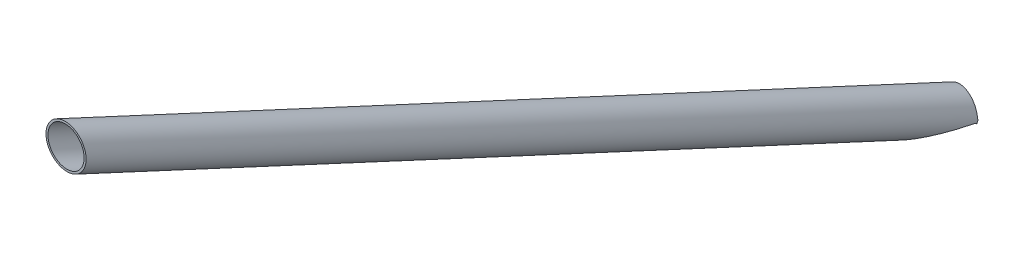
ISO-10303-21;
HEADER;
FILE_DESCRIPTION(('STEP AP214'),'2;1');
FILE_NAME('part.step','',(''),(''),'','','');
FILE_SCHEMA(('AUTOMOTIVE_DESIGN { 1 0 10303 214 1 1 1 1 }'));
ENDSEC;
DATA;
#1=APPLICATION_CONTEXT('core data for automotive mechanical design processes');
#2=APPLICATION_PROTOCOL_DEFINITION('international standard','automotive_design',2000,#1);
#3=PRODUCT_CONTEXT('',#1,'mechanical');
#4=PRODUCT('Part','Part','',(#3));
#5=PRODUCT_RELATED_PRODUCT_CATEGORY('part','',(#4));
#6=PRODUCT_DEFINITION_FORMATION('','',#4);
#7=PRODUCT_DEFINITION_CONTEXT('part definition',#1,'design');
#8=PRODUCT_DEFINITION('design','',#6,#7);
#9=PRODUCT_DEFINITION_SHAPE('','',#8);
#10=(LENGTH_UNIT() NAMED_UNIT(*) SI_UNIT(.MILLI.,.METRE.));
#11=(NAMED_UNIT(*) PLANE_ANGLE_UNIT() SI_UNIT($,.RADIAN.));
#12=(NAMED_UNIT(*) SI_UNIT($,.STERADIAN.) SOLID_ANGLE_UNIT());
#13=UNCERTAINTY_MEASURE_WITH_UNIT(LENGTH_MEASURE(1.E-05),#10,'distance_accuracy_value','');
#14=(GEOMETRIC_REPRESENTATION_CONTEXT(3) GLOBAL_UNCERTAINTY_ASSIGNED_CONTEXT((#13)) GLOBAL_UNIT_ASSIGNED_CONTEXT((#10,
#11,#12)) REPRESENTATION_CONTEXT('',''));
#15=CARTESIAN_POINT('',(0.,0.,0.));
#16=DIRECTION('',(0.,0.,1.));
#17=DIRECTION('',(1.,0.,0.));
#18=AXIS2_PLACEMENT_3D('',#15,#16,#17);
#19=CARTESIAN_POINT('',(238.578451545606,263.413321195737,924.828445427606));
#20=DIRECTION('',(-0.125935860789219,0.361465966011555,0.923841173786172));
#21=DIRECTION('',(0.,-0.931255470532932,0.364366914802222));
#22=AXIS2_PLACEMENT_3D('',#19,#20,#21);
#23=CYLINDRICAL_SURFACE('',#22,12.7);
#24=CARTESIAN_POINT('',(170.006234196331,460.231944821897,1427.861));
#25=DIRECTION('',(0.,0.,-1.));
#26=DIRECTION('',(-0.329006657768653,0.944327601600155,0.));
#27=AXIS2_PLACEMENT_3D('',#24,#25,#26);
#28=ELLIPSE('',#27,13.7469517059429,12.7);
#29=CARTESIAN_POINT('',(165.483395561052,473.213570755684,1427.861));
#30=VERTEX_POINT('',#29);
#31=EDGE_CURVE('E158',#30,#30,#28,.T.);
#32=ORIENTED_EDGE('',*,*,#31,.T.);
#33=EDGE_LOOP('',(#32));
#34=FACE_BOUND('',#33,.T.);
#35=CARTESIAN_POINT('',(238.578451545606,263.413321195737,924.828445427606));
#36=DIRECTION('',(0.125935860789219,-0.361465966011555,-0.923841173786172));
#37=DIRECTION('',(-0.954086751467199,0.210986526767557,-0.212610338876855));
#38=AXIS2_PLACEMENT_3D('',#35,#36,#37);
#39=CIRCLE('',#38,12.7);
#40=CARTESIAN_POINT('',(251.162272400525,264.573616406887,926.089860392744));
#41=VERTEX_POINT('',#40);
#42=CARTESIAN_POINT('',(251.081438817533,262.535172699457,926.876411368852));
#43=VERTEX_POINT('',#42);
#44=EDGE_CURVE('E53',#41,#43,#39,.T.);
#45=ORIENTED_EDGE('',*,*,#44,.F.);
#46=CARTESIAN_POINT('',(241.922856229249,276.336746641463,924.68186899289));
#47=CARTESIAN_POINT('',(242.262411150871,276.237672237515,924.72694670792));
#48=CARTESIAN_POINT('',(242.597517083185,276.12352683015,924.772089891833));
#49=CARTESIAN_POINT('',(243.256419238333,275.86648253904,924.862245588027));
#50=CARTESIAN_POINT('',(243.58021886095,275.723592387698,924.907258135793));
#51=CARTESIAN_POINT('',(244.213374189463,275.410845398106,924.996786914815));
#52=CARTESIAN_POINT('',(244.522769528821,275.241069004146,925.041304215563));
#53=CARTESIAN_POINT('',(245.126097823624,274.875815825225,925.129746354796));
#54=CARTESIAN_POINT('',(245.420029983002,274.680337718912,925.173671162692));
#55=CARTESIAN_POINT('',(245.990299317339,274.265575169599,925.260658832707));
#56=CARTESIAN_POINT('',(246.266652061151,274.04631227023,925.303722433688));
#57=CARTESIAN_POINT('',(246.800413907524,273.585630053523,925.388802990756));
#58=CARTESIAN_POINT('',(247.057821942322,273.344209489054,925.430819887761));
#59=CARTESIAN_POINT('',(247.552420104961,272.840896963311,925.513601812352));
#60=CARTESIAN_POINT('',(247.789593522159,272.578988417823,925.554365787785));
#61=CARTESIAN_POINT('',(248.242205985125,272.036813973223,925.634346308955));
#62=CARTESIAN_POINT('',(248.457644980311,271.756548031393,925.673562851091));
#63=CARTESIAN_POINT('',(248.873442685707,271.16865748399,925.751603251134));
#64=CARTESIAN_POINT('',(249.072917414143,270.860397984614,925.79035557583));
#65=CARTESIAN_POINT('',(249.446213337708,270.228444177305,925.865434475569));
#66=CARTESIAN_POINT('',(249.620034166063,269.904749648785,925.901761015927));
#67=CARTESIAN_POINT('',(249.940997873069,269.244508971226,925.971320132337));
#68=CARTESIAN_POINT('',(250.08816878064,268.907976780618,926.004555940938));
#69=CARTESIAN_POINT('',(250.355374435541,268.224072358801,926.066866856188));
#70=CARTESIAN_POINT('',(250.47541877739,267.87670400991,926.095943432596));
#71=CARTESIAN_POINT('',(250.670724880743,267.230641574006,926.143437897566));
#72=CARTESIAN_POINT('',(250.750098255658,266.933260209038,926.162820931987));
#73=CARTESIAN_POINT('',(250.854866332449,266.483724564644,926.185561746119));
#74=CARTESIAN_POINT('',(250.887396900451,266.3333627301,926.192085054185));
#75=CARTESIAN_POINT('',(250.947821508132,266.031611987735,926.201880697294));
#76=CARTESIAN_POINT('',(250.975716480279,265.880223292864,926.205153686811));
#77=CARTESIAN_POINT('',(251.021822581999,265.60799115388,926.206007740189));
#78=CARTESIAN_POINT('',(251.040844405692,265.487287202669,926.204623468168));
#79=CARTESIAN_POINT('',(251.076381955181,265.245762443692,926.195909665446));
#80=CARTESIAN_POINT('',(251.092900557582,265.124941933115,926.188587021333));
#81=CARTESIAN_POINT('',(251.118114998871,264.930332812895,926.167246646989));
#82=CARTESIAN_POINT('',(251.127385258331,264.856240835769,926.156863718569));
#83=CARTESIAN_POINT('',(251.145525852742,264.709261442482,926.128728011509));
#84=CARTESIAN_POINT('',(251.154396360907,264.636373513441,926.110978459585));
#85=CARTESIAN_POINT('',(251.169176741359,264.51857769072,926.071400081837));
#86=CARTESIAN_POINT('',(251.175070512926,264.472563366372,926.052995765354));
#87=CARTESIAN_POINT('',(251.187009479439,264.384103591962,926.009244973893));
#88=CARTESIAN_POINT('',(251.193053881537,264.341643135962,925.983929836162));
#89=CARTESIAN_POINT('',(251.205437129778,264.261916580206,925.925198378812));
#90=CARTESIAN_POINT('',(251.211778582547,264.224716625475,925.891691276711));
#91=CARTESIAN_POINT('',(251.224586685495,264.157641087422,925.817976956216));
#92=CARTESIAN_POINT('',(251.231053588476,264.127782421808,925.777754614109));
#93=CARTESIAN_POINT('',(251.246311701868,264.065311915536,925.677659039281));
#94=CARTESIAN_POINT('',(251.255088242855,264.035684906454,925.61597789017));
#95=CARTESIAN_POINT('',(251.272509910974,263.985091472119,925.488523759406));
#96=CARTESIAN_POINT('',(251.281152000731,263.964238558655,925.422709098249));
#97=CARTESIAN_POINT('',(251.308426120727,263.906340818248,925.209815930993));
#98=CARTESIAN_POINT('',(251.326605186995,263.87988218589,925.05996741095));
#99=CARTESIAN_POINT('',(251.362078114321,263.837274695233,924.75845134548));
#100=CARTESIAN_POINT('',(251.379367379388,263.821175216613,924.606778547755));
#101=CARTESIAN_POINT('',(251.411389957092,263.795778399172,924.318275725269));
#102=CARTESIAN_POINT('',(251.426204384389,263.785955780488,924.181505004447));
#103=CARTESIAN_POINT('',(251.455058307651,263.76919427726,923.908866718447));
#104=CARTESIAN_POINT('',(251.469103269597,263.762231852804,923.773001222246));
#105=CARTESIAN_POINT('',(251.482839229459,263.755883172903,923.637135312614));
#106=B_SPLINE_CURVE_WITH_KNOTS('',3,(#46,#47,#48,#49,#50,#51,#52,#53,#54,#55,#56,#57,#58,#59,
#60,#61,#62,#63,#64,#65,#66,#67,#68,#69,#70,#71,#72,#73,#74,#75,#76,#77,#78,#79,#80,#81,#82,#83,
#84,#85,#86,#87,#88,#89,#90,#91,#92,#93,#94,#95,#96,#97,#98,#99,#100,#101,#102,#103,#104,#105),
.UNSPECIFIED.,.F.,.F.,(4,2,2,2,2,2,2,2,2,2,2,2,2,2,2,2,2,2,2,2,2,2,2,2,2,2,2,2,2,4),(0.,
1.06932203985242,2.13831971821239,3.20417734427003,4.27008978871623,5.33504469497544,
6.40005957844102,7.46594565218874,8.53183420642118,9.63822100305156,10.7446236162239,
11.8498557303447,12.9546963158468,13.8791506293445,14.3410095990932,14.8027755513842,
15.1693092572021,15.5354185094987,15.7614140869847,15.9873107785913,16.1366027105678,
16.2852286087658,16.435582824056,16.5862803437388,16.792075900042,17.0004575852587,
17.4588252341184,17.9193619381744,18.333059790004,18.7432811144552),.UNSPECIFIED.);
#107=CARTESIAN_POINT('',(248.342187202382,271.900947930097,925.652840738979));
#108=VERTEX_POINT('',#107);
#109=EDGE_CURVE('E152',#108,#41,#106,.T.);
#110=ORIENTED_EDGE('',*,*,#109,.F.);
#111=CARTESIAN_POINT('',(238.578451545606,263.413321195737,924.828445427607));
#112=DIRECTION('',(-0.122453148788901,0.0445630118117606,0.991473330115313));
#113=DIRECTION('',(-0.0309977592476633,0.998332347767805,-0.048699715831288));
#114=AXIS2_PLACEMENT_3D('',#111,#112,#113);
#115=ELLIPSE('',#114,13.4037909779089,12.7);
#116=CARTESIAN_POINT('',(228.310650750504,271.159917359586,923.212127422702));
#117=VERTEX_POINT('',#116);
#118=EDGE_CURVE('E108',#117,#108,#115,.F.);
#119=ORIENTED_EDGE('',*,*,#118,.F.);
#120=CARTESIAN_POINT('',(225.646317693144,263.622872240042,925.858789337785));
#121=CARTESIAN_POINT('',(225.655901365763,263.616459151996,925.777361565495));
#122=CARTESIAN_POINT('',(225.665529145158,263.610460547168,925.695914763437));
#123=CARTESIAN_POINT('',(225.68488246258,263.599553382559,925.53291627918));
#124=CARTESIAN_POINT('',(225.694608049883,263.594645404278,925.451364564238));
#125=CARTESIAN_POINT('',(225.724055399065,263.581905189945,925.20553898038));
#126=CARTESIAN_POINT('',(225.743925327928,263.576145549706,925.041135238718));
#127=CARTESIAN_POINT('',(225.775394524851,263.576294112822,924.783380320311));
#128=CARTESIAN_POINT('',(225.78685797151,263.57823628783,924.690020438377));
#129=CARTESIAN_POINT('',(225.809915058105,263.588582509962,924.503554296212));
#130=CARTESIAN_POINT('',(225.821508668141,263.596985101791,924.4104479836));
#131=CARTESIAN_POINT('',(225.840477257073,263.620544052181,924.25989658196));
#132=CARTESIAN_POINT('',(225.847836970057,263.632084109778,924.201919237305));
#133=CARTESIAN_POINT('',(225.862494803956,263.662582517849,924.087933196828));
#134=CARTESIAN_POINT('',(225.869793042214,263.681519009425,924.031919225323));
#135=CARTESIAN_POINT('',(225.882263331803,263.723519190496,923.938614725316));
#136=CARTESIAN_POINT('',(225.887488825755,263.744179948912,923.900280213494));
#137=CARTESIAN_POINT('',(225.897689459554,263.791871269276,923.827802573712));
#138=CARTESIAN_POINT('',(225.902665086035,263.818888816796,923.793651096099));
#139=CARTESIAN_POINT('',(225.912294353592,263.87863584486,923.730782700962));
#140=CARTESIAN_POINT('',(225.916948094726,263.911363539151,923.70206408976));
#141=CARTESIAN_POINT('',(225.925977120997,263.980961916997,923.650092663858));
#142=CARTESIAN_POINT('',(225.930351770319,264.01784156593,923.626852025778));
#143=CARTESIAN_POINT('',(225.944795781601,264.145767996329,923.556470264184));
#144=CARTESIAN_POINT('',(225.954531279469,264.242363756187,923.519730010505));
#145=CARTESIAN_POINT('',(225.97477189998,264.439628982703,923.459016816524));
#146=CARTESIAN_POINT('',(225.985283567309,264.54032885797,923.435171067918));
#147=CARTESIAN_POINT('',(226.008870470168,264.752844535268,923.392397100581));
#148=CARTESIAN_POINT('',(226.022095683306,264.864787585554,923.374174211526));
#149=CARTESIAN_POINT('',(226.050752845563,265.089077911937,923.342458023692));
#150=CARTESIAN_POINT('',(226.066186490534,265.201425433395,923.328968387307));
#151=CARTESIAN_POINT('',(226.116172945638,265.538772718869,923.292840784606));
#152=CARTESIAN_POINT('',(226.154373045896,265.763712966651,923.27460204485));
#153=CARTESIAN_POINT('',(226.241050397965,266.211542294074,923.244100822862));
#154=CARTESIAN_POINT('',(226.289509404427,266.434434291738,923.231827856636));
#155=CARTESIAN_POINT('',(226.39684573224,266.877682952541,923.211351721589));
#156=CARTESIAN_POINT('',(226.455714499301,267.098041540375,923.203145232007));
#157=CARTESIAN_POINT('',(226.628503149979,267.687971240258,923.185159262084));
#158=CARTESIAN_POINT('',(226.752248068249,268.054803972949,923.178250641586));
#159=CARTESIAN_POINT('',(227.029543469008,268.777313377976,923.171240361049));
#160=CARTESIAN_POINT('',(227.183112332975,269.13298301228,923.171142912396));
#161=CARTESIAN_POINT('',(227.519471934561,269.830570273933,923.176918596933));
#162=CARTESIAN_POINT('',(227.702287370928,270.172475969426,923.182796799233));
#163=CARTESIAN_POINT('',(228.09608690005,270.839447726772,923.200002374726));
#164=CARTESIAN_POINT('',(228.30706608648,271.16451670804,923.211328799693));
#165=CARTESIAN_POINT('',(228.75475620444,271.793363737143,923.238966794875));
#166=CARTESIAN_POINT('',(228.991310356383,272.097254609362,923.255248990681));
#167=CARTESIAN_POINT('',(229.4897874978,272.683213960644,923.292489948961));
#168=CARTESIAN_POINT('',(229.751712195898,272.965280967635,923.313449026531));
#169=CARTESIAN_POINT('',(230.299006935089,273.504736459327,923.359697474432));
#170=CARTESIAN_POINT('',(230.584353897856,273.762148707356,923.384982608255));
#171=CARTESIAN_POINT('',(231.176779673728,274.25010744338,923.439565394204));
#172=CARTESIAN_POINT('',(231.483855220155,274.480657956037,923.468862443796));
#173=CARTESIAN_POINT('',(232.065636140808,274.877209805306,923.526023695821));
#174=CARTESIAN_POINT('',(232.33741532141,275.04760021769,923.553337807897));
#175=CARTESIAN_POINT('',(232.893141781157,275.366698744102,923.610314768169));
#176=CARTESIAN_POINT('',(233.177086932223,275.51541063028,923.639977206356));
#177=CARTESIAN_POINT('',(233.756040770679,275.790235335369,923.701482198961));
#178=CARTESIAN_POINT('',(234.05106612385,275.916312316425,923.733328102208));
#179=CARTESIAN_POINT('',(234.650099539008,276.14465327807,923.798941049343));
#180=CARTESIAN_POINT('',(234.954110672027,276.246909008806,923.832708753772));
#181=CARTESIAN_POINT('',(235.261681681007,276.336746641463,923.867317506495));
#182=B_SPLINE_CURVE_WITH_KNOTS('',3,(#120,#121,#122,#123,#124,#125,#126,#127,#128,#129,#130,
#131,#132,#133,#134,#135,#136,#137,#138,#139,#140,#141,#142,#143,#144,#145,#146,#147,#148,#149,
#150,#151,#152,#153,#154,#155,#156,#157,#158,#159,#160,#161,#162,#163,#164,#165,#166,#167,#168,
#169,#170,#171,#172,#173,#174,#175,#176,#177,#178,#179,#180,#181),.UNSPECIFIED.,.F.,.F.,(4,2,2,
2,2,2,2,2,2,2,2,2,2,2,2,2,2,2,2,2,2,2,2,2,2,2,2,2,2,2,4),(0.,0.246701160101073,
0.493533542380308,0.990352746567353,1.27251583370563,1.55461537845681,1.73305492295526,
1.91097106204404,2.04199859027092,2.17276016134315,2.30348090056599,2.43448952628438,
2.74340178953967,3.05530802368064,3.3975986012706,3.74015344816172,4.42637313897308,
5.11138249740551,5.79583153878297,6.95598301980176,8.11685182267095,9.27870620599187,
10.4403584495158,11.5952550508405,12.7502294848522,13.9040792591587,15.0577559305905,
16.0226387812068,16.9873535374515,17.9535825093766,18.9201456130803),.UNSPECIFIED.);
#183=CARTESIAN_POINT('',(225.653172808786,263.618363974927,925.800606021783));
#184=VERTEX_POINT('',#183);
#185=EDGE_CURVE('E89',#184,#117,#182,.T.);
#186=ORIENTED_EDGE('',*,*,#185,.F.);
#187=CARTESIAN_POINT('',(238.578451545606,263.413321195737,924.828445427606));
#188=DIRECTION('',(0.0101939169366115,0.997147905169932,-0.0747806075978722));
#189=DIRECTION('',(-0.134683246519798,0.07547221485565,0.988010307583717));
#190=AXIS2_PLACEMENT_3D('',#187,#188,#189);
#191=ELLIPSE('',#190,43.7831621348584,12.7);
#192=CARTESIAN_POINT('',(250.771915872852,263.618363974929,929.224734128947));
#193=VERTEX_POINT('',#192);
#194=EDGE_CURVE('E95',#193,#184,#191,.F.);
#195=ORIENTED_EDGE('',*,*,#194,.F.);
#196=CARTESIAN_POINT('',(240.953890947356,250.451545600139,926.155937937445));
#197=CARTESIAN_POINT('',(241.295801974405,250.524374113833,926.196623248305));
#198=CARTESIAN_POINT('',(241.634715085205,250.61208220892,926.235660247046));
#199=CARTESIAN_POINT('',(242.304090387623,250.816261194939,926.310222369901));
#200=CARTESIAN_POINT('',(242.634554215928,250.932726468097,926.345748178037));
#201=CARTESIAN_POINT('',(243.284020513383,251.193175654237,926.41301717516));
#202=CARTESIAN_POINT('',(243.603045842802,251.337100572183,926.444768240757));
#203=CARTESIAN_POINT('',(244.228172916208,251.651387079607,926.50443291301));
#204=CARTESIAN_POINT('',(244.53427438074,251.821749240368,926.532346436717));
#205=CARTESIAN_POINT('',(245.131402230483,252.187442312433,926.584232146162));
#206=CARTESIAN_POINT('',(245.422432882994,252.382766100925,926.608205451799));
#207=CARTESIAN_POINT('',(245.987640394138,252.796854841201,926.652177477217));
#208=CARTESIAN_POINT('',(246.26181646187,253.015620891692,926.67217601058));
#209=CARTESIAN_POINT('',(246.791634392583,253.474919508998,926.708206675675));
#210=CARTESIAN_POINT('',(247.047273253911,253.715455586832,926.724238166051));
#211=CARTESIAN_POINT('',(247.538437388862,254.216451115307,926.752389507152));
#212=CARTESIAN_POINT('',(247.773962721192,254.476910507793,926.764509369296));
#213=CARTESIAN_POINT('',(248.229093986521,255.022508218421,926.785205371814));
#214=CARTESIAN_POINT('',(248.448164964391,255.308096366459,926.793686880679));
#215=CARTESIAN_POINT('',(248.862514833963,255.896117121741,926.806863039469));
#216=CARTESIAN_POINT('',(249.057793482364,256.198549901192,926.811557650672));
#217=CARTESIAN_POINT('',(249.423570694757,256.818279469926,926.817467253555));
#218=CARTESIAN_POINT('',(249.594055972856,257.135584108977,926.81868038611));
#219=CARTESIAN_POINT('',(249.909170946756,257.782700404537,926.81809074119));
#220=CARTESIAN_POINT('',(250.053807726024,258.112508604474,926.816288791369));
#221=CARTESIAN_POINT('',(250.266896490329,258.656048825009,926.81161109045));
#222=CARTESIAN_POINT('',(250.343504390723,258.866631294279,926.809396912814));
#223=CARTESIAN_POINT('',(250.486228924638,259.291314829829,926.804488202107));
#224=CARTESIAN_POINT('',(250.552346285841,259.505415650919,926.801793702382));
#225=CARTESIAN_POINT('',(250.673620318755,259.935641591092,926.796540107454));
#226=CARTESIAN_POINT('',(250.728825542064,260.151753048302,926.793980451416));
#227=CARTESIAN_POINT('',(250.828410777356,260.586431164601,926.790047251677));
#228=CARTESIAN_POINT('',(250.872793442353,260.804997208209,926.788673417076));
#229=CARTESIAN_POINT('',(250.938561933248,261.177424364018,926.78950149754));
#230=CARTESIAN_POINT('',(250.962838687436,261.330783490203,926.790744424284));
#231=CARTESIAN_POINT('',(251.005875574348,261.639632850021,926.796883837218));
#232=CARTESIAN_POINT('',(251.024585345376,261.795129967422,926.801812339028));
#233=CARTESIAN_POINT('',(251.047912398624,262.029652985519,926.815515414835));
#234=CARTESIAN_POINT('',(251.05493149138,262.108614115313,926.821199219727));
#235=CARTESIAN_POINT('',(251.06713485705,262.266584471836,926.836052457894));
#236=CARTESIAN_POINT('',(251.072314530295,262.345593331071,926.845230511934));
#237=CARTESIAN_POINT('',(251.080444555703,262.501796030943,926.8691146235));
#238=CARTESIAN_POINT('',(251.083425037961,262.578999808447,926.883741670974));
#239=CARTESIAN_POINT('',(251.086695510185,262.730948903268,926.922465095965));
#240=CARTESIAN_POINT('',(251.087000891497,262.805705815742,926.94650647026));
#241=CARTESIAN_POINT('',(251.084688953761,262.919885608087,926.997405324766));
#242=CARTESIAN_POINT('',(251.083192430107,262.961475726344,927.019284997583));
#243=CARTESIAN_POINT('',(251.078824286437,263.040243961354,927.069618046512));
#244=CARTESIAN_POINT('',(251.075958503571,263.077439978317,927.098043254977));
#245=CARTESIAN_POINT('',(251.068956432199,263.146002032731,927.161251802532));
#246=CARTESIAN_POINT('',(251.064816830372,263.177352519829,927.196051625905));
#247=CARTESIAN_POINT('',(251.055585126968,263.233824093957,927.270415200848));
#248=CARTESIAN_POINT('',(251.050488936933,263.258917323712,927.309999130969));
#249=CARTESIAN_POINT('',(251.03356876893,263.329366955271,927.438715442593));
#250=CARTESIAN_POINT('',(251.020711810969,263.365108907643,927.532775891722));
#251=CARTESIAN_POINT('',(250.993932453152,263.424070532791,927.725473172664));
#252=CARTESIAN_POINT('',(250.979996438896,263.447083637381,927.824158805792));
#253=CARTESIAN_POINT('',(250.949395989398,263.48941926578,928.038387117969));
#254=CARTESIAN_POINT('',(250.932646747991,263.50759480625,928.154143446972));
#255=CARTESIAN_POINT('',(250.898686097722,263.539223841907,928.386251987087));
#256=CARTESIAN_POINT('',(250.88147432088,263.552673449904,928.502604609234));
#257=CARTESIAN_POINT('',(250.82916746681,263.589177839571,928.852527824342));
#258=CARTESIAN_POINT('',(250.793479783602,263.608305775325,929.086412834323));
#259=CARTESIAN_POINT('',(250.724635823222,263.640932961574,929.528822484775));
#260=CARTESIAN_POINT('',(250.691624760044,263.654817673842,929.737346603726));
#261=CARTESIAN_POINT('',(250.624662191864,263.680924927135,930.153363788652));
#262=CARTESIAN_POINT('',(250.590715700634,263.693154807057,930.360857192771));
#263=CARTESIAN_POINT('',(250.556242151768,263.705273976253,930.568275630503));
#264=B_SPLINE_CURVE_WITH_KNOTS('',3,(#196,#197,#198,#199,#200,#201,#202,#203,#204,#205,#206,
#207,#208,#209,#210,#211,#212,#213,#214,#215,#216,#217,#218,#219,#220,#221,#222,#223,#224,#225,
#226,#227,#228,#229,#230,#231,#232,#233,#234,#235,#236,#237,#238,#239,#240,#241,#242,#243,#244,
#245,#246,#247,#248,#249,#250,#251,#252,#253,#254,#255,#256,#257,#258,#259,#260,#261,#262,#263),
.UNSPECIFIED.,.F.,.F.,(4,2,2,2,2,2,2,2,2,2,2,2,2,2,2,2,2,2,2,2,2,2,2,2,2,2,2,2,2,2,2,2,2,4),(0.,
1.0554614577431,2.11071689177497,3.16373020886685,4.21676628365277,5.2695025422486,
6.3222881627534,7.3752438776302,8.42819651904313,9.50708269398439,10.5859799007126,
11.6654531367501,12.7446301011471,13.4166729990211,14.0886692598626,14.7576047424091,
15.4263760786939,15.8921032845991,16.3619238307598,16.6002962240818,16.8392605645278,
17.0748868769833,17.3091566031008,17.4496680341462,17.5895857382102,17.7298705022113,
17.870769089294,18.1726852488679,18.4793671177814,18.8342068085477,19.1893376836892,
19.9012855194524,20.5360215501731,21.1678432927343),.UNSPECIFIED.);
#265=EDGE_CURVE('E79',#43,#193,#264,.T.);
#266=ORIENTED_EDGE('',*,*,#265,.F.);
#267=EDGE_LOOP('',(#45,#110,#119,#186,#195,#266));
#268=FACE_BOUND('',#267,.T.);
#269=ADVANCED_FACE('F43',(#34,#268),#23,.T.);
#270=CARTESIAN_POINT('',(208.25147232796,334.11975729563,939.24649032873));
#271=DIRECTION('',(-0.914176070024527,-0.350648849153989,-0.203291656448299));
#272=DIRECTION('',(0.358127179628723,-0.933672813790343,0.));
#273=AXIS2_PLACEMENT_3D('',#270,#271,#272);
#274=TOROIDAL_SURFACE('',#273,78.232,12.7);
#275=ORIENTED_EDGE('',*,*,#109,.T.);
#276=CARTESIAN_POINT('',(246.780490605957,275.254814558581,921.313375867739));
#277=CARTESIAN_POINT('',(246.959833720715,275.073546275186,921.408747287847));
#278=CARTESIAN_POINT('',(247.133738802633,274.887578398039,921.50521619081));
#279=CARTESIAN_POINT('',(247.470648372158,274.5070387955,921.700034430991));
#280=CARTESIAN_POINT('',(247.633655386224,274.312469081737,921.798383325531));
#281=CARTESIAN_POINT('',(248.106011211016,273.717426884536,922.095592464736));
#282=CARTESIAN_POINT('',(248.399152852673,273.305154394835,922.296860306007));
#283=CARTESIAN_POINT('',(248.940530701253,272.456901585697,922.7025506098));
#284=CARTESIAN_POINT('',(249.188969542029,272.021040527847,922.906954032106));
#285=CARTESIAN_POINT('',(249.642540697629,271.12837571696,923.318051559341));
#286=CARTESIAN_POINT('',(249.847663324021,270.671567306431,923.524746165876));
#287=CARTESIAN_POINT('',(250.357207983269,269.378255220214,924.10023280033));
#288=CARTESIAN_POINT('',(250.614533119109,268.523140294655,924.469886605326));
#289=CARTESIAN_POINT('',(250.988200563709,266.778524749061,925.203429657986));
#290=CARTESIAN_POINT('',(251.104304515106,265.888968601292,925.567308139345));
#291=CARTESIAN_POINT('',(251.171457724687,264.494390038466,926.122110955227));
#292=CARTESIAN_POINT('',(251.172817961061,263.993444847049,926.318298292636));
#293=CARTESIAN_POINT('',(251.129374641208,262.990943391423,926.704619118478));
#294=CARTESIAN_POINT('',(251.084560304436,262.489387011831,926.89475118248));
#295=CARTESIAN_POINT('',(250.948012900679,261.490705538411,927.266885655863));
#296=CARTESIAN_POINT('',(250.856365470129,260.993574035693,927.448902246572));
#297=CARTESIAN_POINT('',(250.625489099855,260.007259450918,927.803339295972));
#298=CARTESIAN_POINT('',(250.486288125581,259.51807187389,927.975765325568));
#299=CARTESIAN_POINT('',(250.174405497402,258.595473990446,928.29422972863));
#300=CARTESIAN_POINT('',(250.005859283551,258.16100320312,928.441246763782));
#301=CARTESIAN_POINT('',(249.628706212228,257.306223551078,928.724278808018));
#302=CARTESIAN_POINT('',(249.420113365554,256.88590979363,928.860297641372));
#303=CARTESIAN_POINT('',(248.961521998664,256.061045632856,929.120523347894));
#304=CARTESIAN_POINT('',(248.711286076915,255.656603060935,929.244655668475));
#305=CARTESIAN_POINT('',(248.170610097755,254.870423268228,929.478555985453));
#306=CARTESIAN_POINT('',(247.880123402757,254.4887131313,929.588307027381));
#307=CARTESIAN_POINT('',(247.569967494961,254.120998290724,929.689900950126));
#308=B_SPLINE_CURVE_WITH_KNOTS('',3,(#276,#277,#278,#279,#280,#281,#282,#283,#284,#285,#286,
#287,#288,#289,#290,#291,#292,#293,#294,#295,#296,#297,#298,#299,#300,#301,#302,#303,#304,#305,
#306,#307),.UNSPECIFIED.,.F.,.F.,(4,2,2,2,2,2,2,2,2,2,2,2,2,2,2,4),(0.,0.816519333742398,
1.63284871571668,3.26342153032261,4.88640591707265,6.50975292918545,9.39749795922311,
12.2901102788416,13.9023628952267,15.5149920153534,17.1246828656304,18.7334287083853,
20.1975344618425,21.6611289105818,23.1333724415538,24.6073363160172),.UNSPECIFIED.);
#309=EDGE_CURVE('E85',#41,#43,#308,.T.);
#310=ORIENTED_EDGE('',*,*,#309,.T.);
#311=ORIENTED_EDGE('',*,*,#265,.T.);
#312=CARTESIAN_POINT('',(238.235643171678,262.849093525537,927.343221509407));
#313=DIRECTION('',(0.131849675085966,0.217011136973921,-0.967223774319579));
#314=DIRECTION('',(0.,0.975742274934391,0.218922390142855));
#315=AXIS2_PLACEMENT_3D('',#312,#313,#314);
#316=CIRCLE('',#315,12.7);
#317=CARTESIAN_POINT('',(248.506011048103,269.716483015888,930.284055620794));
#318=VERTEX_POINT('',#317);
#319=EDGE_CURVE('E83',#318,#193,#316,.T.);
#320=ORIENTED_EDGE('',*,*,#319,.F.);
#321=CARTESIAN_POINT('',(226.318087971258,267.733394850262,930.568275630505));
#322=CARTESIAN_POINT('',(226.356800322612,267.785608994795,930.387604223532));
#323=CARTESIAN_POINT('',(226.397563813991,267.843521769077,930.208849299548));
#324=CARTESIAN_POINT('',(226.484182716925,267.971895596742,929.856744496766));
#325=CARTESIAN_POINT('',(226.530048838402,268.042383237958,929.683407003257));
#326=CARTESIAN_POINT('',(226.627472961693,268.196476608766,929.345303260417));
#327=CARTESIAN_POINT('',(226.679002920562,268.280018500831,929.180500240635));
#328=CARTESIAN_POINT('',(226.788763136951,268.460689616616,928.861010779465));
#329=CARTESIAN_POINT('',(226.846988111127,268.557808139274,928.706316509956));
#330=CARTESIAN_POINT('',(226.971674435168,268.766426179919,928.407213535128));
#331=CARTESIAN_POINT('',(227.038231117932,268.878092887461,928.262960663908));
#332=CARTESIAN_POINT('',(227.17946691889,269.113215495493,927.988692837926));
#333=CARTESIAN_POINT('',(227.254147799898,269.23667395388,927.858680985555));
#334=CARTESIAN_POINT('',(227.411662875389,269.492735716424,927.614003190403));
#335=CARTESIAN_POINT('',(227.494484218452,269.625324510414,927.499313712579));
#336=CARTESIAN_POINT('',(227.668302683914,269.897076176123,927.284948851424));
#337=CARTESIAN_POINT('',(227.75930085711,270.036239891688,927.185275402208));
#338=CARTESIAN_POINT('',(227.963726271159,270.339973190884,926.986011275922));
#339=CARTESIAN_POINT('',(228.078458707336,270.505184072711,926.888745290051));
#340=CARTESIAN_POINT('',(228.318061267938,270.83727259086,926.71109129453));
#341=CARTESIAN_POINT('',(228.442933552892,271.004150575718,926.630706895046));
#342=CARTESIAN_POINT('',(228.702827786708,271.337361393389,926.484384594113));
#343=CARTESIAN_POINT('',(228.837884817866,271.503690070297,926.418500004813));
#344=CARTESIAN_POINT('',(229.117342569304,271.833046028604,926.299464947163));
#345=CARTESIAN_POINT('',(229.261745966469,271.996072346466,926.246318147716));
#346=CARTESIAN_POINT('',(229.615329479776,272.377320879482,926.133053996443));
#347=CARTESIAN_POINT('',(229.828490599023,272.593310527254,926.077799129799));
#348=CARTESIAN_POINT('',(230.270613619983,273.012411860249,925.984097833099));
#349=CARTESIAN_POINT('',(230.49958029117,273.215519622452,925.945656502584));
#350=CARTESIAN_POINT('',(230.971988236276,273.606128684252,925.882696145112));
#351=CARTESIAN_POINT('',(231.215419604511,273.793640457822,925.858167709028));
#352=CARTESIAN_POINT('',(231.715641284906,274.151123041949,925.820768796615));
#353=CARTESIAN_POINT('',(231.972430352885,274.321095481791,925.807897236576));
#354=CARTESIAN_POINT('',(232.501297257672,274.643784659671,925.792001881915));
#355=CARTESIAN_POINT('',(232.773524846117,274.796262121771,925.789101785722));
#356=CARTESIAN_POINT('',(233.328786940642,275.079988008764,925.792121508463));
#357=CARTESIAN_POINT('',(233.611821662049,275.211236010395,925.798041503223));
#358=CARTESIAN_POINT('',(234.187023444908,275.451229447724,925.817628747829));
#359=CARTESIAN_POINT('',(234.479190587582,275.559974683223,925.831296066595));
#360=CARTESIAN_POINT('',(235.070848510649,275.753919118513,925.865533038155));
#361=CARTESIAN_POINT('',(235.370339384483,275.839118017716,925.886102779056));
#362=CARTESIAN_POINT('',(235.984590360374,275.98754124559,925.934253210416));
#363=CARTESIAN_POINT('',(236.299529839459,276.049957928623,925.962040747175));
#364=CARTESIAN_POINT('',(236.932949480791,276.148190832294,926.023701463651));
#365=CARTESIAN_POINT('',(237.251429735072,276.184006359849,926.057574801904));
#366=CARTESIAN_POINT('',(237.889629150411,276.228691636109,926.130989657062));
#367=CARTESIAN_POINT('',(238.209348323641,276.237561119381,926.170531229799));
#368=CARTESIAN_POINT('',(238.847676787282,276.228293937978,926.25500198707));
#369=CARTESIAN_POINT('',(239.166286094702,276.210157689032,926.299931088658));
#370=CARTESIAN_POINT('',(239.795901336539,276.147518337572,926.394412728309));
#371=CARTESIAN_POINT('',(240.106952211918,276.103363269029,926.443897093686));
#372=CARTESIAN_POINT('',(240.723456600989,275.989450906786,926.547979190372));
#373=CARTESIAN_POINT('',(241.028910142398,275.919693739904,926.60257689635));
#374=CARTESIAN_POINT('',(241.632045220477,275.755307241191,926.717047294378));
#375=CARTESIAN_POINT('',(241.929726482303,275.660677031102,926.776920172642));
#376=CARTESIAN_POINT('',(242.515182022907,275.447521213274,926.902282023882));
#377=CARTESIAN_POINT('',(242.802956316765,275.328995641908,926.967770988308));
#378=CARTESIAN_POINT('',(243.368909815877,275.068168433809,927.105507043441));
#379=CARTESIAN_POINT('',(243.646988257431,274.925675653307,927.177806226441));
#380=CARTESIAN_POINT('',(244.188953571481,274.61909910912,927.329564795622));
#381=CARTESIAN_POINT('',(244.452839515454,274.455013935201,927.409024649372));
#382=CARTESIAN_POINT('',(244.964590743243,274.106888950522,927.576406660452));
#383=CARTESIAN_POINT('',(245.212443143193,273.922833402703,927.664335485285));
#384=CARTESIAN_POINT('',(245.689848470492,273.536998928864,927.85031501967));
#385=CARTESIAN_POINT('',(245.919404841228,273.335223352923,927.948363816592));
#386=CARTESIAN_POINT('',(246.318209340523,272.954653730903,928.137950346524));
#387=CARTESIAN_POINT('',(246.490830868067,272.778358219941,928.227426736028));
#388=CARTESIAN_POINT('',(246.821212565302,272.417421703462,928.416386316392));
#389=CARTESIAN_POINT('',(246.978975730579,272.232782391291,928.515867481794));
#390=CARTESIAN_POINT('',(247.277715925788,271.858146430902,928.726416069756));
#391=CARTESIAN_POINT('',(247.418761387896,271.668175859818,928.837432501571));
#392=CARTESIAN_POINT('',(247.683409513629,271.284966908132,929.073708042636));
#393=CARTESIAN_POINT('',(247.807018785758,271.091729796848,929.198961723136));
#394=CARTESIAN_POINT('',(247.995552100397,270.772967825719,929.41954367585));
#395=CARTESIAN_POINT('',(248.06591228845,270.647321720865,929.510082278752));
#396=CARTESIAN_POINT('',(248.198254077344,270.397437190513,929.69882071521));
#397=CARTESIAN_POINT('',(248.260239102766,270.2731982088,929.797017391337));
#398=CARTESIAN_POINT('',(248.375940964259,270.02658495227,930.002306405288));
#399=CARTESIAN_POINT('',(248.429597448098,269.904229596643,930.109455737595));
#400=CARTESIAN_POINT('',(248.528026383487,269.663604588305,930.332371792133));
#401=CARTESIAN_POINT('',(248.572788697647,269.545339723167,930.448148143019));
#402=CARTESIAN_POINT('',(248.612995291157,269.429926550276,930.568275630504));
#403=B_SPLINE_CURVE_WITH_KNOTS('',3,(#321,#322,#323,#324,#325,#326,#327,#328,#329,#330,#331,
#332,#333,#334,#335,#336,#337,#338,#339,#340,#341,#342,#343,#344,#345,#346,#347,#348,#349,#350,
#351,#352,#353,#354,#355,#356,#357,#358,#359,#360,#361,#362,#363,#364,#365,#366,#367,#368,#369,
#370,#371,#372,#373,#374,#375,#376,#377,#378,#379,#380,#381,#382,#383,#384,#385,#386,#387,#388,
#389,#390,#391,#392,#393,#394,#395,#396,#397,#398,#399,#400,#401,#402),.UNSPECIFIED.,.F.,.F.,(4,
2,2,2,2,2,2,2,2,2,2,2,2,2,2,2,2,2,2,2,2,2,2,2,2,2,2,2,2,2,2,2,2,2,2,2,2,2,2,2,4),(0.,
0.576161648370738,1.15355627014495,1.7282109381113,2.30241519222181,2.88392221149904,
3.46555566051072,4.04628519405093,4.62708946368289,5.29635271212657,5.96575893868193,
6.63758674262573,7.30960782312821,8.23369143147709,9.15805512009125,10.0817929247721,
11.0054448429989,11.9405143403497,12.875602478257,13.8106989349357,14.7458073283508,
15.7114250039618,16.677067837472,17.6427201830117,18.6083576633429,19.5613627109667,
20.5143630380907,21.4673970198278,22.4204295508643,23.3814582805213,24.3425498077282,
25.3044042718739,26.2660772814802,27.0527723216722,27.8393084156754,28.6225047510546,
29.4054034444261,29.9153755534031,30.4251385009032,30.9384383976945,31.4523200287053),.UNSPECIFIED.);
#404=CARTESIAN_POINT('',(227.552862031742,269.716483015888,927.427771518618));
#405=VERTEX_POINT('',#404);
#406=EDGE_CURVE('E121',#405,#318,#403,.T.);
#407=ORIENTED_EDGE('',*,*,#406,.F.);
#408=EDGE_CURVE('E102',#184,#405,#316,.T.);
#409=ORIENTED_EDGE('',*,*,#408,.F.);
#410=ORIENTED_EDGE('',*,*,#185,.T.);
#411=CARTESIAN_POINT('',(238.854339974636,264.133570696327,922.345484409331));
#412=DIRECTION('',(-0.106111176079992,-0.277019670043189,0.95498718353708));
#413=DIRECTION('',(0.,-0.96040939371061,-0.278592527667954));
#414=AXIS2_PLACEMENT_3D('',#411,#412,#413);
#415=CIRCLE('',#414,12.7);
#416=EDGE_CURVE('E112',#108,#117,#415,.T.);
#417=ORIENTED_EDGE('',*,*,#416,.F.);
#418=EDGE_LOOP('',(#275,#310,#311,#320,#407,#409,#410,#417));
#419=FACE_BOUND('',#418,.T.);
#420=ADVANCED_FACE('F82',(#419),#274,.F.);
#421=CARTESIAN_POINT('',(238.578451545606,263.413321195737,924.828445427606));
#422=DIRECTION('',(-0.125935860789219,0.361465966011555,0.923841173786172));
#423=DIRECTION('',(0.,-0.931255470532932,0.364366914802222));
#424=AXIS2_PLACEMENT_3D('',#421,#422,#423);
#425=CYLINDRICAL_SURFACE('',#424,11.4554);
#426=CARTESIAN_POINT('',(170.006234196331,460.231944821897,1427.861));
#427=DIRECTION('',(0.,0.,-1.));
#428=DIRECTION('',(-0.329006657768653,0.944327601600155,0.));
#429=AXIS2_PLACEMENT_3D('',#426,#427,#428);
#430=ELLIPSE('',#429,12.3997504387605,11.4554);
#431=CARTESIAN_POINT('',(165.926633747309,471.941371414173,1427.861));
#432=VERTEX_POINT('',#431);
#433=EDGE_CURVE('E11',#432,#432,#430,.T.);
#434=ORIENTED_EDGE('',*,*,#433,.F.);
#435=EDGE_LOOP('',(#434));
#436=FACE_BOUND('',#435,.T.);
#437=ORIENTED_EDGE('',*,*,#406,.T.);
#438=CARTESIAN_POINT('',(248.506011048103,269.716483015888,930.284055620794));
#439=CARTESIAN_POINT('',(248.559534941841,269.582009886929,930.411159017407));
#440=CARTESIAN_POINT('',(248.607316258043,269.450302910583,930.543650198769));
#441=CARTESIAN_POINT('',(248.691684719549,269.194310886118,930.818804494975));
#442=CARTESIAN_POINT('',(248.728278490226,269.07002148048,930.961461527535));
#443=CARTESIAN_POINT('',(248.790080787197,268.832682613731,931.253917801808));
#444=CARTESIAN_POINT('',(248.815477116582,268.719474675359,931.403548644486));
#445=CARTESIAN_POINT('',(248.856540724784,268.503018111922,931.711100995207));
#446=CARTESIAN_POINT('',(248.872207254016,268.3997702547,931.869023140996));
#447=CARTESIAN_POINT('',(248.897748746489,268.177950337188,932.234397040454));
#448=CARTESIAN_POINT('',(248.90500979948,268.062509275858,932.443934787417));
#449=CARTESIAN_POINT('',(248.907776302447,267.848142322168,932.871365294386));
#450=CARTESIAN_POINT('',(248.903276379054,267.749224000705,933.089261828556));
#451=CARTESIAN_POINT('',(248.884646840281,267.566041509771,933.532243788806));
#452=CARTESIAN_POINT('',(248.870457445823,267.481872409846,933.757365526141));
#453=CARTESIAN_POINT('',(248.834302102746,267.327114665117,934.211498620587));
#454=CARTESIAN_POINT('',(248.812337454165,267.256523753054,934.440509321364));
#455=CARTESIAN_POINT('',(248.751811139045,267.100172545098,934.996228640372));
#456=CARTESIAN_POINT('',(248.710141586089,267.020193316488,935.324212918452));
#457=CARTESIAN_POINT('',(248.617471740247,266.878435096825,935.982857251407));
#458=CARTESIAN_POINT('',(248.566465634813,266.816667506471,936.313518849817));
#459=CARTESIAN_POINT('',(248.457052393167,266.707299847144,936.976690150085));
#460=CARTESIAN_POINT('',(248.398628873018,266.659731947318,937.309202335689));
#461=CARTESIAN_POINT('',(248.275834394648,266.575895290555,937.974436703227));
#462=CARTESIAN_POINT('',(248.211464745925,266.539624053444,938.307158822973));
#463=CARTESIAN_POINT('',(248.077091454077,266.47577849221,938.975177185104));
#464=CARTESIAN_POINT('',(248.0070454968,266.448278823542,939.310471880246));
#465=CARTESIAN_POINT('',(247.862378721071,266.400582360213,939.980593366519));
#466=CARTESIAN_POINT('',(247.787757724344,266.380385850346,940.315420138896));
#467=CARTESIAN_POINT('',(247.634439495509,266.345943144673,940.983921439513));
#468=CARTESIAN_POINT('',(247.55574838106,266.331688294454,941.317596936606));
#469=CARTESIAN_POINT('',(247.394433229392,266.308027638058,941.984161159253));
#470=CARTESIAN_POINT('',(247.311809206131,266.298621814673,942.317049887594));
#471=CARTESIAN_POINT('',(247.12931842576,266.282648314995,943.03488468946));
#472=CARTESIAN_POINT('',(247.02880084107,266.276770948697,943.419680517247));
#473=CARTESIAN_POINT('',(246.822784516097,266.26941491549,944.187982030851));
#474=CARTESIAN_POINT('',(246.717285640142,266.26793636846,944.571487681223));
#475=CARTESIAN_POINT('',(246.39333707311,266.268895564471,945.71998993091));
#476=CARTESIAN_POINT('',(246.167453493088,266.276729409789,946.482900856432));
#477=CARTESIAN_POINT('',(245.694750525019,266.302411851553,948.00363466412));
#478=CARTESIAN_POINT('',(245.447891588363,266.320279739272,948.761444891044));
#479=CARTESIAN_POINT('',(244.93201068275,266.363237688409,950.269200545428));
#480=CARTESIAN_POINT('',(244.66299110746,266.38832697054,951.01914681247));
#481=CARTESIAN_POINT('',(244.102057374224,266.443594845383,952.504759194255));
#482=CARTESIAN_POINT('',(243.810302533021,266.473739474899,953.240486295555));
#483=CARTESIAN_POINT('',(243.351599517727,266.521815131152,954.335237700223));
#484=CARTESIAN_POINT('',(243.195157784648,266.53831990977,954.69874385066));
#485=CARTESIAN_POINT('',(242.8746420546,266.572139170945,955.422332106078));
#486=CARTESIAN_POINT('',(242.710568338476,266.589453623707,955.782414336468));
#487=CARTESIAN_POINT('',(242.374489867445,266.624712595635,956.497721209666));
#488=CARTESIAN_POINT('',(242.202506203424,266.642655411941,956.852955828705));
#489=CARTESIAN_POINT('',(241.849353966735,266.679085323914,957.558786487101));
#490=CARTESIAN_POINT('',(241.66818597966,266.697572384849,957.909382820403));
#491=CARTESIAN_POINT('',(241.295667306499,266.734956692184,958.60488200426));
#492=CARTESIAN_POINT('',(241.104321897506,266.753853723059,958.949787686234));
#493=CARTESIAN_POINT('',(240.71003507954,266.791934074602,959.632862039948));
#494=CARTESIAN_POINT('',(240.507095433554,266.811117351418,959.971031725454));
#495=CARTESIAN_POINT('',(240.187478630021,266.840475214373,960.480308219986));
#496=CARTESIAN_POINT('',(240.075627272873,266.850599644222,960.654452664562));
#497=CARTESIAN_POINT('',(239.847941490704,266.87086188391,961.000115346829));
#498=CARTESIAN_POINT('',(239.732107086659,266.880999693677,961.171633598345));
#499=CARTESIAN_POINT('',(239.377994130062,266.911404732344,961.681910558666));
#500=CARTESIAN_POINT('',(239.133218416567,266.931653113053,962.016210286951));
#501=CARTESIAN_POINT('',(238.624244388411,266.971723618365,962.667244443542));
#502=CARTESIAN_POINT('',(238.360149827637,266.991547373362,962.984058679699));
#503=CARTESIAN_POINT('',(237.945487254343,267.0207159813,963.442303732142));
#504=CARTESIAN_POINT('',(237.804239889122,267.030340604675,963.592166065244));
#505=CARTESIAN_POINT('',(237.514849992732,267.049329488494,963.885070757833));
#506=CARTESIAN_POINT('',(237.366709229808,267.058693814733,964.028114847439));
#507=CARTESIAN_POINT('',(237.107160074985,267.074386100571,964.265302211615));
#508=CARTESIAN_POINT('',(236.997660471332,267.080802065038,964.361525531181));
#509=CARTESIAN_POINT('',(236.774551842541,267.093413725067,964.54907768379));
#510=CARTESIAN_POINT('',(236.660942922653,267.099609426261,964.640406642039));
#511=CARTESIAN_POINT('',(236.313102091184,267.11781405848,964.906150211682));
#512=CARTESIAN_POINT('',(236.072148604085,267.129422473736,965.072048402418));
#513=CARTESIAN_POINT('',(235.5677407876,267.151129362862,965.373613289844));
#514=CARTESIAN_POINT('',(235.304058159241,267.161208789684,965.508907558357));
#515=CARTESIAN_POINT('',(234.75735838695,267.17880283304,965.732518122615));
#516=CARTESIAN_POINT('',(234.474407927447,267.186325804753,965.820987992047));
#517=CARTESIAN_POINT('',(233.984765379279,267.195993288578,965.917275864606));
#518=CARTESIAN_POINT('',(233.781365530247,267.199080232517,965.941525432442));
#519=CARTESIAN_POINT('',(233.373372533623,267.203210246544,965.955424378905));
#520=CARTESIAN_POINT('',(233.168780768118,267.204255338788,965.945108017582));
#521=CARTESIAN_POINT('',(232.764296367708,267.20418130859,965.888724404727));
#522=CARTESIAN_POINT('',(232.564410728371,267.203059147711,965.842607015226));
#523=CARTESIAN_POINT('',(232.175223911796,267.198777385125,965.717480733487));
#524=CARTESIAN_POINT('',(231.985933513411,267.195615748118,965.638439012269));
#525=CARTESIAN_POINT('',(231.563594472088,267.186286744318,965.42352516245));
#526=CARTESIAN_POINT('',(231.335735062743,267.179483760369,965.27757720772));
#527=CARTESIAN_POINT('',(230.905970287299,267.163701279448,964.951648449748));
#528=CARTESIAN_POINT('',(230.704125714293,267.154716820951,964.77159027471));
#529=CARTESIAN_POINT('',(230.350910147841,267.13661861712,964.415023876255));
#530=CARTESIAN_POINT('',(230.196425919135,267.127697694382,964.241523477856));
#531=CARTESIAN_POINT('',(229.902922172875,267.109056115964,963.881830783255));
#532=CARTESIAN_POINT('',(229.763915102705,267.099334827369,963.695628462949));
#533=CARTESIAN_POINT('',(229.499133241634,267.079303673987,963.313535079557));
#534=CARTESIAN_POINT('',(229.373389352284,267.068992517414,963.117622888138));
#535=CARTESIAN_POINT('',(229.13370560484,267.047969428292,962.718869287044));
#536=CARTESIAN_POINT('',(229.019762095236,267.037257621125,962.516030046867));
#537=CARTESIAN_POINT('',(228.753673615375,267.010726148877,962.013620652506));
#538=CARTESIAN_POINT('',(228.607063576478,266.994752656973,961.711133938537));
#539=CARTESIAN_POINT('',(228.331371920163,266.962472856506,961.098227955081));
#540=CARTESIAN_POINT('',(228.202298949295,266.946166388294,960.787804861583));
#541=CARTESIAN_POINT('',(227.958738730349,266.913377892823,960.160681423429));
#542=CARTESIAN_POINT('',(227.844278608234,266.896895598884,959.843970630352));
#543=CARTESIAN_POINT('',(227.628081145738,266.863925537076,959.206328804236));
#544=CARTESIAN_POINT('',(227.526341654382,266.847437770606,958.885398494859));
#545=CARTESIAN_POINT('',(227.333351991044,266.814473048504,958.238494225209));
#546=CARTESIAN_POINT('',(227.242162455091,266.79799664889,957.91250225036));
#547=CARTESIAN_POINT('',(227.069567712257,266.765239944939,957.257932027492));
#548=CARTESIAN_POINT('',(226.988162806003,266.74895964664,956.929353700339));
#549=CARTESIAN_POINT('',(226.834136876016,266.716697674256,956.270515820708));
#550=CARTESIAN_POINT('',(226.761506401623,266.70071569484,955.940258483617));
#551=CARTESIAN_POINT('',(226.624051253897,266.669111665577,955.278100123561));
#552=CARTESIAN_POINT('',(226.559226967144,266.653489633586,954.946199020039));
#553=CARTESIAN_POINT('',(226.368529029076,266.605568789878,953.911563512067));
#554=CARTESIAN_POINT('',(226.25484878135,266.574025823136,953.206529091673));
#555=CARTESIAN_POINT('',(226.053742961638,266.51366655485,951.792579596569));
#556=CARTESIAN_POINT('',(225.966321852344,266.484850717346,951.083663883062));
#557=CARTESIAN_POINT('',(225.814087927026,266.430837940191,949.662436673413));
#558=CARTESIAN_POINT('',(225.749302182561,266.405645354928,948.950122136903));
#559=CARTESIAN_POINT('',(225.639909774068,266.360107989917,947.523867083628));
#560=CARTESIAN_POINT('',(225.595301551713,266.339762835854,946.809926696713));
#561=CARTESIAN_POINT('',(225.524601657195,266.305599384225,945.384166065178));
#562=CARTESIAN_POINT('',(225.498428458824,266.291752441209,944.672350526282));
#563=CARTESIAN_POINT('',(225.463109422932,266.272708080255,943.248116896889));
#564=CARTESIAN_POINT('',(225.453965183692,266.267511474212,942.535698756112));
#565=CARTESIAN_POINT('',(225.452140976984,266.269068467517,941.111541918096));
#566=CARTESIAN_POINT('',(225.459444156957,266.275809833318,940.399803272261));
#567=CARTESIAN_POINT('',(225.482896372761,266.298796127146,939.332816496329));
#568=CARTESIAN_POINT('',(225.492795482505,266.308602722305,938.977284240214));
#569=CARTESIAN_POINT('',(225.516901844023,266.333467793282,938.266554073042));
#570=CARTESIAN_POINT('',(225.531108941475,266.348526080977,937.911356150464));
#571=CARTESIAN_POINT('',(225.56442684712,266.385491062499,937.19353954804));
#572=CARTESIAN_POINT('',(225.583640404407,266.407543654931,936.830932936078));
#573=CARTESIAN_POINT('',(225.627207534998,266.460062304932,936.106589707855));
#574=CARTESIAN_POINT('',(225.651561541271,266.490529071278,935.744853167477));
#575=CARTESIAN_POINT('',(225.706095143962,266.562196973358,935.021995233169));
#576=CARTESIAN_POINT('',(225.736288291873,266.603423158914,934.660877280842));
#577=CARTESIAN_POINT('',(225.803424261699,266.699595223423,933.941082214894));
#578=CARTESIAN_POINT('',(225.840366282362,266.754539473993,933.582404816759));
#579=CARTESIAN_POINT('',(225.916228842663,266.872483964905,932.923550926914));
#580=CARTESIAN_POINT('',(225.953987221154,266.932975426625,932.622799551316));
#581=CARTESIAN_POINT('',(226.036782042188,267.069966251944,932.025799088555));
#582=CARTESIAN_POINT('',(226.081820439087,267.146469915728,931.729551233814));
#583=CARTESIAN_POINT('',(226.180832449315,267.318943648637,931.14552377894));
#584=CARTESIAN_POINT('',(226.234769075004,267.414833491638,930.857714701613));
#585=CARTESIAN_POINT('',(226.354153216687,267.630334387763,930.293606186463));
#586=CARTESIAN_POINT('',(226.419590190085,267.749923727792,930.017296491417));
#587=CARTESIAN_POINT('',(226.53798629525,267.966698944841,929.581290605405));
#588=CARTESIAN_POINT('',(226.586572935868,268.055745377206,929.416349998324));
#589=CARTESIAN_POINT('',(226.690247108052,268.244833994635,929.095066946683));
#590=CARTESIAN_POINT('',(226.745332135797,268.344871943668,928.938721224342));
#591=CARTESIAN_POINT('',(226.862623073049,268.555601836847,928.636523972371));
#592=CARTESIAN_POINT('',(226.924819511944,268.666279580875,928.490658897416));
#593=CARTESIAN_POINT('',(227.056900573101,268.897455033106,928.21074673151));
#594=CARTESIAN_POINT('',(227.126781819692,269.017948423653,928.076694497828));
#595=CARTESIAN_POINT('',(227.255007951749,269.234265146558,927.855148070836));
#596=CARTESIAN_POINT('',(227.311518165492,269.328188371143,927.764714855599));
#597=CARTESIAN_POINT('',(227.428903381351,269.519741949029,927.590916662443));
#598=CARTESIAN_POINT('',(227.489777672868,269.617371697588,927.5075505386));
#599=CARTESIAN_POINT('',(227.552862031742,269.716483015888,927.427771518618));
#600=B_SPLINE_CURVE_WITH_KNOTS('',3,(#438,#439,#440,#441,#442,#443,#444,#445,#446,#447,#448,
#449,#450,#451,#452,#453,#454,#455,#456,#457,#458,#459,#460,#461,#462,#463,#464,#465,#466,#467,
#468,#469,#470,#471,#472,#473,#474,#475,#476,#477,#478,#479,#480,#481,#482,#483,#484,#485,#486,
#487,#488,#489,#490,#491,#492,#493,#494,#495,#496,#497,#498,#499,#500,#501,#502,#503,#504,#505,
#506,#507,#508,#509,#510,#511,#512,#513,#514,#515,#516,#517,#518,#519,#520,#521,#522,#523,#524,
#525,#526,#527,#528,#529,#530,#531,#532,#533,#534,#535,#536,#537,#538,#539,#540,#541,#542,#543,
#544,#545,#546,#547,#548,#549,#550,#551,#552,#553,#554,#555,#556,#557,#558,#559,#560,#561,#562,
#563,#564,#565,#566,#567,#568,#569,#570,#571,#572,#573,#574,#575,#576,#577,#578,#579,#580,#581,
#582,#583,#584,#585,#586,#587,#588,#589,#590,#591,#592,#593,#594,#595,#596,#597,#598,#599),
.UNSPECIFIED.,.F.,.F.,(4,2,2,2,2,2,2,2,2,2,2,2,2,2,2,2,2,2,2,2,2,2,2,2,2,2,2,2,2,2,2,2,2,2,2,2,
2,2,2,2,2,2,2,2,2,2,2,2,2,2,2,2,2,2,2,2,2,2,2,2,2,2,2,2,2,2,2,2,2,2,2,2,2,2,2,2,2,2,2,2,4),(0.,
0.57773297022762,1.15512313569194,1.72242222021668,2.28976500413141,3.00660544823523,
3.72377346055409,4.44540648949358,5.16691891683487,6.18650630088279,7.2067306099313,
8.22924897766184,9.25154269363752,10.2823184078121,11.3131343138371,12.3424434783062,
13.3717489899551,14.5649357797449,15.75815508654,18.1448133256173,20.536075899052,
22.9270805194159,25.3026219220563,26.4908044809142,27.678943350906,28.864079601213,
30.0491403820363,31.2335925763659,32.4178651431509,33.0394723701905,33.6610763238492,
34.9049242517524,36.1425232889385,36.7608276712795,37.3789743154174,37.8165778623322,
38.2541702091691,39.1305521650406,40.0170852248827,40.9006923460881,41.5127082419287,
42.1241177171874,42.7363849961119,43.3492642360583,44.1567392171591,44.9660682033726,
45.6625119856958,46.3595118922737,47.0581014281188,47.7564741423035,48.7653011258483,
49.7746237145686,50.7857934868525,51.7967920450282,52.8133395242429,53.8299182283216,
54.8453920571426,55.8609161538418,58.0047519958808,60.1489519730321,62.2957076731354,
64.4422975491076,66.57933380697,68.7165706298757,70.8516185669729,71.9189834717043,
72.9863101459152,74.077553573961,75.1688889519378,76.2627881751629,77.3565576104417,
78.2834195479253,79.2105307204786,80.1338809849301,81.0563891695704,81.6367757296148,
82.2169393933194,82.7963392316574,83.3754855686324,83.8015130849262,84.2274713885037),.UNSPECIFIED.);
#601=EDGE_CURVE('E98',#318,#405,#600,.T.);
#602=ORIENTED_EDGE('',*,*,#601,.T.);
#603=EDGE_LOOP('',(#437,#602));
#604=FACE_BOUND('',#603,.T.);
#605=ADVANCED_FACE('F133',(#436,#604),#425,.F.);
#606=CARTESIAN_POINT('',(238.235643171678,262.849093525537,927.343221509407));
#607=DIRECTION('',(-0.131849675085967,-0.217011136973921,0.967223774319579));
#608=DIRECTION('',(0.,-0.975742274934391,-0.218922390142855));
#609=AXIS2_PLACEMENT_3D('',#606,#607,#608);
#610=CYLINDRICAL_SURFACE('',#609,12.7);
#611=ORIENTED_EDGE('',*,*,#319,.T.);
#612=ORIENTED_EDGE('',*,*,#194,.T.);
#613=ORIENTED_EDGE('',*,*,#408,.T.);
#614=ORIENTED_EDGE('',*,*,#601,.F.);
#615=EDGE_LOOP('',(#611,#612,#613,#614));
#616=FACE_BOUND('',#615,.T.);
#617=ADVANCED_FACE('F93',(#616),#610,.F.);
#618=CARTESIAN_POINT('',(269.282458758721,343.570890467878,648.496258235093));
#619=DIRECTION('',(-0.106111176079996,-0.277019670043181,0.954987183537082));
#620=DIRECTION('',(0.,-0.960409393710613,-0.278592527667946));
#621=AXIS2_PLACEMENT_3D('',#618,#619,#620);
#622=CYLINDRICAL_SURFACE('',#621,12.7);
#623=ORIENTED_EDGE('',*,*,#118,.T.);
#624=ORIENTED_EDGE('',*,*,#416,.T.);
#625=EDGE_LOOP('',(#623,#624));
#626=FACE_BOUND('',#625,.T.);
#627=ADVANCED_FACE('F134',(#626),#622,.F.);
#628=CARTESIAN_POINT('',(238.578451545606,263.413321195737,924.828445427606));
#629=DIRECTION('',(0.125935860789219,-0.361465966011555,-0.923841173786172));
#630=DIRECTION('',(-0.954086751467199,0.210986526767557,-0.212610338876855));
#631=AXIS2_PLACEMENT_3D('',#628,#629,#630);
#632=PLANE('',#631);
#633=ORIENTED_EDGE('',*,*,#309,.F.);
#634=ORIENTED_EDGE('',*,*,#44,.T.);
#635=EDGE_LOOP('',(#633,#634));
#636=FACE_BOUND('',#635,.T.);
#637=ADVANCED_FACE('F135',(#636),#632,.T.);
#638=CARTESIAN_POINT('',(5.35682609381638E-12,3.10862446895044E-12,1427.86100000001));
#639=DIRECTION('',(0.,0.,-1.));
#640=DIRECTION('',(-1.,0.,0.));
#641=AXIS2_PLACEMENT_3D('',#638,#639,#640);
#642=PLANE('',#641);
#643=ORIENTED_EDGE('',*,*,#433,.T.);
#644=EDGE_LOOP('',(#643));
#645=FACE_BOUND('',#644,.T.);
#646=ORIENTED_EDGE('',*,*,#31,.F.);
#647=EDGE_LOOP('',(#646));
#648=FACE_BOUND('',#647,.T.);
#649=ADVANCED_FACE('F45',(#645,#648),#642,.F.);
#650=CLOSED_SHELL('',(#269,#420,#605,#617,#627,#637,#649));
#651=MANIFOLD_SOLID_BREP('B2',#650);
#652=ADVANCED_BREP_SHAPE_REPRESENTATION('',(#18,#651),#14);
#653=SHAPE_DEFINITION_REPRESENTATION(#9,#652);
ENDSEC;
END-ISO-10303-21;
